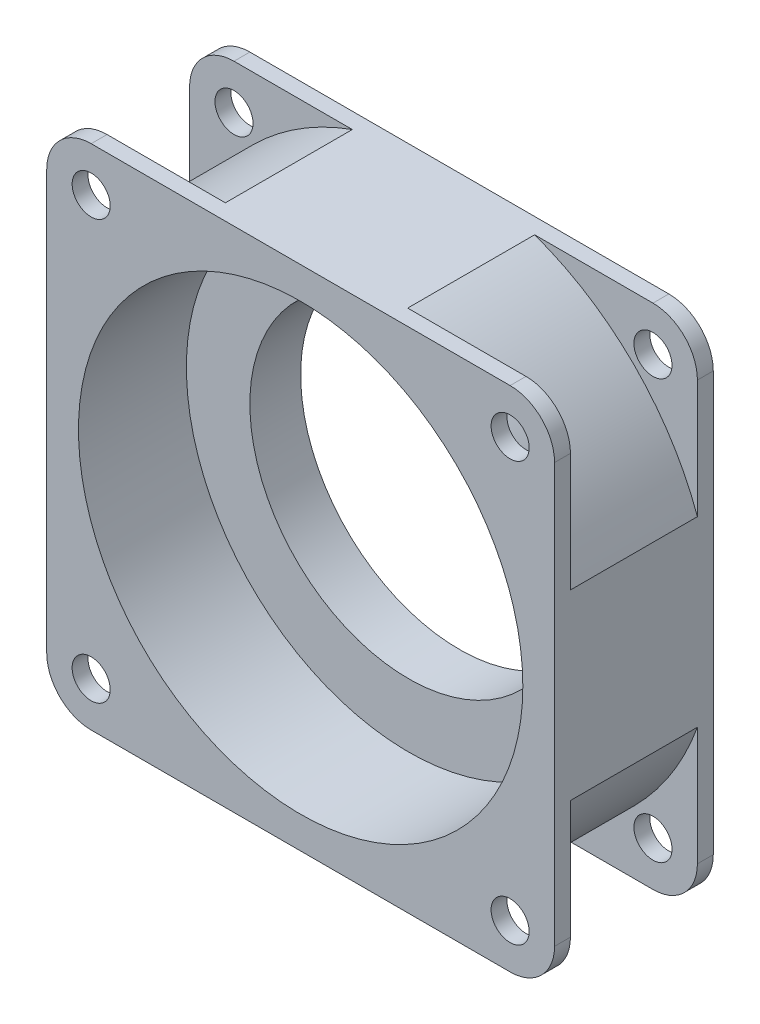
ISO-10303-21;
HEADER;
FILE_DESCRIPTION(('STEP AP214'),'2;1');
FILE_NAME('part.step','',(''),(''),'','','');
FILE_SCHEMA(('AUTOMOTIVE_DESIGN { 1 0 10303 214 1 1 1 1 }'));
ENDSEC;
DATA;
#1=APPLICATION_CONTEXT('core data for automotive mechanical design processes');
#2=APPLICATION_PROTOCOL_DEFINITION('international standard','automotive_design',2000,#1);
#3=PRODUCT_CONTEXT('',#1,'mechanical');
#4=PRODUCT('Part','Part','',(#3));
#5=PRODUCT_RELATED_PRODUCT_CATEGORY('part','',(#4));
#6=PRODUCT_DEFINITION_FORMATION('','',#4);
#7=PRODUCT_DEFINITION_CONTEXT('part definition',#1,'design');
#8=PRODUCT_DEFINITION('design','',#6,#7);
#9=PRODUCT_DEFINITION_SHAPE('','',#8);
#10=(LENGTH_UNIT() NAMED_UNIT(*) SI_UNIT(.MILLI.,.METRE.));
#11=(NAMED_UNIT(*) PLANE_ANGLE_UNIT() SI_UNIT($,.RADIAN.));
#12=(NAMED_UNIT(*) SI_UNIT($,.STERADIAN.) SOLID_ANGLE_UNIT());
#13=UNCERTAINTY_MEASURE_WITH_UNIT(LENGTH_MEASURE(1.E-05),#10,'distance_accuracy_value','');
#14=(GEOMETRIC_REPRESENTATION_CONTEXT(3) GLOBAL_UNCERTAINTY_ASSIGNED_CONTEXT((#13)) GLOBAL_UNIT_ASSIGNED_CONTEXT((#10,
#11,#12)) REPRESENTATION_CONTEXT('',''));
#15=CARTESIAN_POINT('',(0.,0.,0.));
#16=DIRECTION('',(0.,0.,1.));
#17=DIRECTION('',(1.,0.,0.));
#18=AXIS2_PLACEMENT_3D('',#15,#16,#17);
#19=CARTESIAN_POINT('',(0.,0.,12.5));
#20=DIRECTION('',(0.,0.,-1.));
#21=DIRECTION('',(-1.,0.,0.));
#22=AXIS2_PLACEMENT_3D('',#19,#20,#21);
#23=CYLINDRICAL_SURFACE('',#22,42.5);
#24=DIRECTION('',(0.,0.,-1.));
#25=VECTOR('',#24,1.);
#26=CARTESIAN_POINT('',(14.3614066163451,-40.,12.5));
#27=LINE('',#26,#25);
#28=CARTESIAN_POINT('',(14.3614066163451,-40.,10.));
#29=VERTEX_POINT('',#28);
#30=CARTESIAN_POINT('',(14.3614066163451,-40.,-10.));
#31=VERTEX_POINT('',#30);
#32=EDGE_CURVE('E403',#29,#31,#27,.T.);
#33=ORIENTED_EDGE('',*,*,#32,.T.);
#34=CARTESIAN_POINT('',(0.,0.,-10.));
#35=DIRECTION('',(0.,0.,1.));
#36=DIRECTION('',(1.,0.,0.));
#37=AXIS2_PLACEMENT_3D('',#34,#35,#36);
#38=CIRCLE('',#37,42.5);
#39=CARTESIAN_POINT('',(40.,-14.3614066163451,-10.));
#40=VERTEX_POINT('',#39);
#41=EDGE_CURVE('E282',#31,#40,#38,.T.);
#42=ORIENTED_EDGE('',*,*,#41,.T.);
#43=DIRECTION('',(0.,0.,-1.));
#44=VECTOR('',#43,1.);
#45=CARTESIAN_POINT('',(40.,-14.3614066163451,12.5));
#46=LINE('',#45,#44);
#47=CARTESIAN_POINT('',(40.,-14.3614066163451,10.));
#48=VERTEX_POINT('',#47);
#49=EDGE_CURVE('E53',#48,#40,#46,.T.);
#50=ORIENTED_EDGE('',*,*,#49,.F.);
#51=CARTESIAN_POINT('',(0.,0.,10.));
#52=DIRECTION('',(0.,0.,1.));
#53=DIRECTION('',(1.,0.,0.));
#54=AXIS2_PLACEMENT_3D('',#51,#52,#53);
#55=CIRCLE('',#54,42.5);
#56=EDGE_CURVE('E311',#29,#48,#55,.T.);
#57=ORIENTED_EDGE('',*,*,#56,.F.);
#58=EDGE_LOOP('',(#33,#42,#50,#57));
#59=FACE_BOUND('',#58,.T.);
#60=ADVANCED_FACE('F39',(#59),#23,.T.);
#61=CARTESIAN_POINT('',(0.,0.,12.5));
#62=DIRECTION('',(0.,0.,-1.));
#63=DIRECTION('',(-1.,0.,0.));
#64=AXIS2_PLACEMENT_3D('',#61,#62,#63);
#65=CYLINDRICAL_SURFACE('',#64,42.5);
#66=DIRECTION('',(0.,0.,-1.));
#67=VECTOR('',#66,1.);
#68=CARTESIAN_POINT('',(-40.,-14.3614066163451,12.5));
#69=LINE('',#68,#67);
#70=CARTESIAN_POINT('',(-40.,-14.3614066163451,10.));
#71=VERTEX_POINT('',#70);
#72=CARTESIAN_POINT('',(-40.,-14.3614066163451,-10.));
#73=VERTEX_POINT('',#72);
#74=EDGE_CURVE('E391',#71,#73,#69,.T.);
#75=ORIENTED_EDGE('',*,*,#74,.T.);
#76=CARTESIAN_POINT('',(0.,0.,-10.));
#77=DIRECTION('',(0.,0.,1.));
#78=DIRECTION('',(1.,0.,0.));
#79=AXIS2_PLACEMENT_3D('',#76,#77,#78);
#80=CIRCLE('',#79,42.5);
#81=CARTESIAN_POINT('',(-14.3614066163451,-40.,-10.));
#82=VERTEX_POINT('',#81);
#83=EDGE_CURVE('E255',#73,#82,#80,.T.);
#84=ORIENTED_EDGE('',*,*,#83,.T.);
#85=DIRECTION('',(0.,0.,-1.));
#86=VECTOR('',#85,1.);
#87=CARTESIAN_POINT('',(-14.3614066163451,-40.,12.5));
#88=LINE('',#87,#86);
#89=CARTESIAN_POINT('',(-14.3614066163451,-40.,10.));
#90=VERTEX_POINT('',#89);
#91=EDGE_CURVE('E65',#90,#82,#88,.T.);
#92=ORIENTED_EDGE('',*,*,#91,.F.);
#93=CARTESIAN_POINT('',(0.,0.,10.));
#94=DIRECTION('',(0.,0.,1.));
#95=DIRECTION('',(1.,0.,0.));
#96=AXIS2_PLACEMENT_3D('',#93,#94,#95);
#97=CIRCLE('',#96,42.5);
#98=EDGE_CURVE('E347',#71,#90,#97,.T.);
#99=ORIENTED_EDGE('',*,*,#98,.F.);
#100=EDGE_LOOP('',(#75,#84,#92,#99));
#101=FACE_BOUND('',#100,.T.);
#102=ADVANCED_FACE('F498',(#101),#65,.T.);
#103=CARTESIAN_POINT('',(0.,0.,12.5));
#104=DIRECTION('',(0.,0.,-1.));
#105=DIRECTION('',(-1.,0.,0.));
#106=AXIS2_PLACEMENT_3D('',#103,#104,#105);
#107=CYLINDRICAL_SURFACE('',#106,42.5);
#108=DIRECTION('',(0.,0.,-1.));
#109=VECTOR('',#108,1.);
#110=CARTESIAN_POINT('',(-14.3614066163451,40.,12.5));
#111=LINE('',#110,#109);
#112=CARTESIAN_POINT('',(-14.3614066163451,40.,10.));
#113=VERTEX_POINT('',#112);
#114=CARTESIAN_POINT('',(-14.3614066163451,40.,-10.));
#115=VERTEX_POINT('',#114);
#116=EDGE_CURVE('E396',#113,#115,#111,.T.);
#117=ORIENTED_EDGE('',*,*,#116,.T.);
#118=CARTESIAN_POINT('',(0.,0.,-10.));
#119=DIRECTION('',(0.,0.,1.));
#120=DIRECTION('',(1.,0.,0.));
#121=AXIS2_PLACEMENT_3D('',#118,#119,#120);
#122=CIRCLE('',#121,42.5);
#123=CARTESIAN_POINT('',(-40.,14.3614066163451,-10.));
#124=VERTEX_POINT('',#123);
#125=EDGE_CURVE('E913',#115,#124,#122,.T.);
#126=ORIENTED_EDGE('',*,*,#125,.T.);
#127=DIRECTION('',(0.,0.,-1.));
#128=VECTOR('',#127,1.);
#129=CARTESIAN_POINT('',(-40.,14.3614066163451,12.5));
#130=LINE('',#129,#128);
#131=CARTESIAN_POINT('',(-40.,14.3614066163451,10.));
#132=VERTEX_POINT('',#131);
#133=EDGE_CURVE('E398',#132,#124,#130,.T.);
#134=ORIENTED_EDGE('',*,*,#133,.F.);
#135=CARTESIAN_POINT('',(0.,0.,10.));
#136=DIRECTION('',(0.,0.,1.));
#137=DIRECTION('',(1.,0.,0.));
#138=AXIS2_PLACEMENT_3D('',#135,#136,#137);
#139=CIRCLE('',#138,42.5);
#140=EDGE_CURVE('E372',#113,#132,#139,.T.);
#141=ORIENTED_EDGE('',*,*,#140,.F.);
#142=EDGE_LOOP('',(#117,#126,#134,#141));
#143=FACE_BOUND('',#142,.T.);
#144=ADVANCED_FACE('F529',(#143),#107,.T.);
#145=CARTESIAN_POINT('',(33.,33.,12.5));
#146=DIRECTION('',(0.,0.,-1.));
#147=DIRECTION('',(-1.,0.,0.));
#148=AXIS2_PLACEMENT_3D('',#145,#146,#147);
#149=CYLINDRICAL_SURFACE('',#148,7.);
#150=CARTESIAN_POINT('',(33.,33.,10.));
#151=DIRECTION('',(0.,0.,1.));
#152=DIRECTION('',(1.,0.,0.));
#153=AXIS2_PLACEMENT_3D('',#150,#151,#152);
#154=CIRCLE('',#153,7.);
#155=CARTESIAN_POINT('',(33.,40.,10.));
#156=VERTEX_POINT('',#155);
#157=CARTESIAN_POINT('',(40.,32.9999999999999,10.));
#158=VERTEX_POINT('',#157);
#159=EDGE_CURVE('E410',#156,#158,#154,.F.);
#160=ORIENTED_EDGE('',*,*,#159,.F.);
#161=DIRECTION('',(0.,0.,-1.));
#162=VECTOR('',#161,1.);
#163=CARTESIAN_POINT('',(33.,40.,12.5));
#164=LINE('',#163,#162);
#165=CARTESIAN_POINT('',(33.,40.,12.5));
#166=VERTEX_POINT('',#165);
#167=EDGE_CURVE('E50',#166,#156,#164,.T.);
#168=ORIENTED_EDGE('',*,*,#167,.F.);
#169=CARTESIAN_POINT('',(33.,33.,12.5));
#170=DIRECTION('',(0.,0.,1.));
#171=DIRECTION('',(1.,0.,0.));
#172=AXIS2_PLACEMENT_3D('',#169,#170,#171);
#173=CIRCLE('',#172,7.);
#174=CARTESIAN_POINT('',(40.,32.9999999999999,12.5));
#175=VERTEX_POINT('',#174);
#176=EDGE_CURVE('E409',#166,#175,#173,.F.);
#177=ORIENTED_EDGE('',*,*,#176,.T.);
#178=DIRECTION('',(0.,0.,-1.));
#179=VECTOR('',#178,1.);
#180=CARTESIAN_POINT('',(40.,32.9999999999999,12.5));
#181=LINE('',#180,#179);
#182=EDGE_CURVE('E419',#175,#158,#181,.T.);
#183=ORIENTED_EDGE('',*,*,#182,.T.);
#184=EDGE_LOOP('',(#160,#168,#177,#183));
#185=FACE_BOUND('',#184,.T.);
#186=ADVANCED_FACE('F41',(#185),#149,.T.);
#187=CARTESIAN_POINT('',(0.,40.,12.5));
#188=DIRECTION('',(0.,1.,0.));
#189=DIRECTION('',(0.,0.,1.));
#190=AXIS2_PLACEMENT_3D('',#187,#188,#189);
#191=PLANE('',#190);
#192=DIRECTION('',(1.,0.,0.));
#193=VECTOR('',#192,1.);
#194=CARTESIAN_POINT('',(0.,40.,-10.));
#195=LINE('',#194,#193);
#196=CARTESIAN_POINT('',(-33.,40.,-10.));
#197=VERTEX_POINT('',#196);
#198=EDGE_CURVE('E908',#197,#115,#195,.T.);
#199=ORIENTED_EDGE('',*,*,#198,.T.);
#200=ORIENTED_EDGE('',*,*,#116,.F.);
#201=DIRECTION('',(1.,0.,0.));
#202=VECTOR('',#201,1.);
#203=CARTESIAN_POINT('',(0.,40.,10.));
#204=LINE('',#203,#202);
#205=CARTESIAN_POINT('',(-33.,40.,10.));
#206=VERTEX_POINT('',#205);
#207=EDGE_CURVE('E362',#206,#113,#204,.T.);
#208=ORIENTED_EDGE('',*,*,#207,.F.);
#209=DIRECTION('',(0.,0.,-1.));
#210=VECTOR('',#209,1.);
#211=CARTESIAN_POINT('',(-33.,40.,12.5));
#212=LINE('',#211,#210);
#213=CARTESIAN_POINT('',(-33.,40.,12.5));
#214=VERTEX_POINT('',#213);
#215=EDGE_CURVE('E364',#214,#206,#212,.T.);
#216=ORIENTED_EDGE('',*,*,#215,.F.);
#217=DIRECTION('',(1.,0.,0.));
#218=VECTOR('',#217,1.);
#219=CARTESIAN_POINT('',(0.,40.,12.5));
#220=LINE('',#219,#218);
#221=EDGE_CURVE('E413',#214,#166,#220,.T.);
#222=ORIENTED_EDGE('',*,*,#221,.T.);
#223=ORIENTED_EDGE('',*,*,#167,.T.);
#224=DIRECTION('',(1.,0.,0.));
#225=VECTOR('',#224,1.);
#226=CARTESIAN_POINT('',(0.,40.,10.));
#227=LINE('',#226,#225);
#228=CARTESIAN_POINT('',(14.3614066163451,40.,10.));
#229=VERTEX_POINT('',#228);
#230=EDGE_CURVE('E421',#229,#156,#227,.T.);
#231=ORIENTED_EDGE('',*,*,#230,.F.);
#232=DIRECTION('',(0.,0.,-1.));
#233=VECTOR('',#232,1.);
#234=CARTESIAN_POINT('',(14.3614066163451,40.,12.5));
#235=LINE('',#234,#233);
#236=CARTESIAN_POINT('',(14.3614066163451,40.,-10.));
#237=VERTEX_POINT('',#236);
#238=EDGE_CURVE('E399',#229,#237,#235,.T.);
#239=ORIENTED_EDGE('',*,*,#238,.T.);
#240=DIRECTION('',(1.,0.,0.));
#241=VECTOR('',#240,1.);
#242=CARTESIAN_POINT('',(0.,40.,-10.));
#243=LINE('',#242,#241);
#244=CARTESIAN_POINT('',(33.,40.,-10.));
#245=VERTEX_POINT('',#244);
#246=EDGE_CURVE('E303',#237,#245,#243,.T.);
#247=ORIENTED_EDGE('',*,*,#246,.T.);
#248=DIRECTION('',(0.,0.,1.));
#249=VECTOR('',#248,1.);
#250=CARTESIAN_POINT('',(33.,40.,-12.5));
#251=LINE('',#250,#249);
#252=CARTESIAN_POINT('',(33.,40.,-12.5));
#253=VERTEX_POINT('',#252);
#254=EDGE_CURVE('E209',#253,#245,#251,.T.);
#255=ORIENTED_EDGE('',*,*,#254,.F.);
#256=DIRECTION('',(1.,0.,0.));
#257=VECTOR('',#256,1.);
#258=CARTESIAN_POINT('',(0.,40.,-12.5));
#259=LINE('',#258,#257);
#260=CARTESIAN_POINT('',(-33.,40.,-12.5));
#261=VERTEX_POINT('',#260);
#262=EDGE_CURVE('E205',#261,#253,#259,.T.);
#263=ORIENTED_EDGE('',*,*,#262,.F.);
#264=DIRECTION('',(0.,0.,1.));
#265=VECTOR('',#264,1.);
#266=CARTESIAN_POINT('',(-33.,40.,-12.5));
#267=LINE('',#266,#265);
#268=EDGE_CURVE('E210',#261,#197,#267,.T.);
#269=ORIENTED_EDGE('',*,*,#268,.T.);
#270=EDGE_LOOP('',(#199,#200,#208,#216,#222,#223,#231,#239,#247,#255,#263,#269));
#271=FACE_BOUND('',#270,.T.);
#272=ADVANCED_FACE('F202',(#271),#191,.T.);
#273=CARTESIAN_POINT('',(40.,0.,12.5));
#274=DIRECTION('',(-1.,0.,0.));
#275=DIRECTION('',(0.,0.,1.));
#276=AXIS2_PLACEMENT_3D('',#273,#274,#275);
#277=PLANE('',#276);
#278=DIRECTION('',(0.,1.,0.));
#279=VECTOR('',#278,1.);
#280=CARTESIAN_POINT('',(40.,0.,-12.5));
#281=LINE('',#280,#279);
#282=CARTESIAN_POINT('',(40.,-33.,-12.5));
#283=VERTEX_POINT('',#282);
#284=CARTESIAN_POINT('',(40.,32.9999999999999,-12.5));
#285=VERTEX_POINT('',#284);
#286=EDGE_CURVE('E214',#283,#285,#281,.T.);
#287=ORIENTED_EDGE('',*,*,#286,.T.);
#288=DIRECTION('',(0.,0.,1.));
#289=VECTOR('',#288,1.);
#290=CARTESIAN_POINT('',(40.,32.9999999999999,-12.5));
#291=LINE('',#290,#289);
#292=CARTESIAN_POINT('',(40.,32.9999999999999,-10.));
#293=VERTEX_POINT('',#292);
#294=EDGE_CURVE('E308',#285,#293,#291,.T.);
#295=ORIENTED_EDGE('',*,*,#294,.T.);
#296=DIRECTION('',(0.,1.,0.));
#297=VECTOR('',#296,1.);
#298=CARTESIAN_POINT('',(40.,0.,-10.));
#299=LINE('',#298,#297);
#300=CARTESIAN_POINT('',(40.,14.3614066163451,-10.));
#301=VERTEX_POINT('',#300);
#302=EDGE_CURVE('E234',#301,#293,#299,.T.);
#303=ORIENTED_EDGE('',*,*,#302,.F.);
#304=DIRECTION('',(0.,0.,-1.));
#305=VECTOR('',#304,1.);
#306=CARTESIAN_POINT('',(40.,14.3614066163451,12.5));
#307=LINE('',#306,#305);
#308=CARTESIAN_POINT('',(40.,14.3614066163451,10.));
#309=VERTEX_POINT('',#308);
#310=EDGE_CURVE('E405',#309,#301,#307,.T.);
#311=ORIENTED_EDGE('',*,*,#310,.F.);
#312=DIRECTION('',(0.,1.,0.));
#313=VECTOR('',#312,1.);
#314=CARTESIAN_POINT('',(40.,0.,10.));
#315=LINE('',#314,#313);
#316=EDGE_CURVE('E427',#309,#158,#315,.T.);
#317=ORIENTED_EDGE('',*,*,#316,.T.);
#318=ORIENTED_EDGE('',*,*,#182,.F.);
#319=DIRECTION('',(0.,1.,0.));
#320=VECTOR('',#319,1.);
#321=CARTESIAN_POINT('',(40.,0.,12.5));
#322=LINE('',#321,#320);
#323=CARTESIAN_POINT('',(40.,-33.,12.5));
#324=VERTEX_POINT('',#323);
#325=EDGE_CURVE('E414',#324,#175,#322,.T.);
#326=ORIENTED_EDGE('',*,*,#325,.F.);
#327=DIRECTION('',(0.,0.,-1.));
#328=VECTOR('',#327,1.);
#329=CARTESIAN_POINT('',(40.,-33.,12.5));
#330=LINE('',#329,#328);
#331=CARTESIAN_POINT('',(40.,-33.,10.));
#332=VERTEX_POINT('',#331);
#333=EDGE_CURVE('E316',#324,#332,#330,.T.);
#334=ORIENTED_EDGE('',*,*,#333,.T.);
#335=DIRECTION('',(0.,1.,0.));
#336=VECTOR('',#335,1.);
#337=CARTESIAN_POINT('',(40.,0.,10.));
#338=LINE('',#337,#336);
#339=EDGE_CURVE('E322',#332,#48,#338,.T.);
#340=ORIENTED_EDGE('',*,*,#339,.T.);
#341=ORIENTED_EDGE('',*,*,#49,.T.);
#342=DIRECTION('',(0.,1.,0.));
#343=VECTOR('',#342,1.);
#344=CARTESIAN_POINT('',(40.,0.,-10.));
#345=LINE('',#344,#343);
#346=CARTESIAN_POINT('',(40.,-33.,-10.));
#347=VERTEX_POINT('',#346);
#348=EDGE_CURVE('E281',#347,#40,#345,.T.);
#349=ORIENTED_EDGE('',*,*,#348,.F.);
#350=DIRECTION('',(0.,0.,1.));
#351=VECTOR('',#350,1.);
#352=CARTESIAN_POINT('',(40.,-33.,-12.5));
#353=LINE('',#352,#351);
#354=EDGE_CURVE('E253',#283,#347,#353,.T.);
#355=ORIENTED_EDGE('',*,*,#354,.F.);
#356=EDGE_LOOP('',(#287,#295,#303,#311,#317,#318,#326,#334,#340,#341,#349,#355));
#357=FACE_BOUND('',#356,.T.);
#358=ADVANCED_FACE('F446',(#357),#277,.F.);
#359=CARTESIAN_POINT('',(33.,33.,12.5));
#360=DIRECTION('',(0.,0.,-1.));
#361=DIRECTION('',(-1.,0.,0.));
#362=AXIS2_PLACEMENT_3D('',#359,#360,#361);
#363=CYLINDRICAL_SURFACE('',#362,3.);
#364=CARTESIAN_POINT('',(33.,33.,12.5));
#365=DIRECTION('',(0.,0.,1.));
#366=DIRECTION('',(1.,0.,0.));
#367=AXIS2_PLACEMENT_3D('',#364,#365,#366);
#368=CIRCLE('',#367,3.);
#369=CARTESIAN_POINT('',(36.,33.,12.5));
#370=VERTEX_POINT('',#369);
#371=EDGE_CURVE('E417',#370,#370,#368,.F.);
#372=ORIENTED_EDGE('',*,*,#371,.F.);
#373=EDGE_LOOP('',(#372));
#374=FACE_BOUND('',#373,.T.);
#375=CARTESIAN_POINT('',(33.,33.,10.));
#376=DIRECTION('',(0.,0.,1.));
#377=DIRECTION('',(1.,0.,0.));
#378=AXIS2_PLACEMENT_3D('',#375,#376,#377);
#379=CIRCLE('',#378,3.);
#380=CARTESIAN_POINT('',(36.,33.,10.));
#381=VERTEX_POINT('',#380);
#382=EDGE_CURVE('E415',#381,#381,#379,.F.);
#383=ORIENTED_EDGE('',*,*,#382,.T.);
#384=EDGE_LOOP('',(#383));
#385=FACE_BOUND('',#384,.T.);
#386=ADVANCED_FACE('F543',(#374,#385),#363,.F.);
#387=CARTESIAN_POINT('',(0.,0.,12.5));
#388=DIRECTION('',(0.,0.,1.));
#389=DIRECTION('',(1.,0.,0.));
#390=AXIS2_PLACEMENT_3D('',#387,#388,#389);
#391=PLANE('',#390);
#392=ORIENTED_EDGE('',*,*,#176,.F.);
#393=ORIENTED_EDGE('',*,*,#221,.F.);
#394=CARTESIAN_POINT('',(-33.,33.,12.5));
#395=DIRECTION('',(0.,0.,1.));
#396=DIRECTION('',(1.,0.,0.));
#397=AXIS2_PLACEMENT_3D('',#394,#395,#396);
#398=CIRCLE('',#397,7.);
#399=CARTESIAN_POINT('',(-40.,32.9999999999999,12.5));
#400=VERTEX_POINT('',#399);
#401=EDGE_CURVE('E363',#400,#214,#398,.F.);
#402=ORIENTED_EDGE('',*,*,#401,.F.);
#403=DIRECTION('',(0.,1.,0.));
#404=VECTOR('',#403,1.);
#405=CARTESIAN_POINT('',(-40.,0.,12.5));
#406=LINE('',#405,#404);
#407=CARTESIAN_POINT('',(-40.,-33.,12.5));
#408=VERTEX_POINT('',#407);
#409=EDGE_CURVE('E389',#408,#400,#406,.T.);
#410=ORIENTED_EDGE('',*,*,#409,.F.);
#411=CARTESIAN_POINT('',(-33.,-33.,12.5));
#412=DIRECTION('',(0.,0.,1.));
#413=DIRECTION('',(1.,0.,0.));
#414=AXIS2_PLACEMENT_3D('',#411,#412,#413);
#415=CIRCLE('',#414,7.);
#416=CARTESIAN_POINT('',(-33.,-40.,12.5));
#417=VERTEX_POINT('',#416);
#418=EDGE_CURVE('E331',#417,#408,#415,.F.);
#419=ORIENTED_EDGE('',*,*,#418,.F.);
#420=DIRECTION('',(1.,0.,0.));
#421=VECTOR('',#420,1.);
#422=CARTESIAN_POINT('',(0.,-40.,12.5));
#423=LINE('',#422,#421);
#424=CARTESIAN_POINT('',(33.,-40.,12.5));
#425=VERTEX_POINT('',#424);
#426=EDGE_CURVE('E387',#417,#425,#423,.T.);
#427=ORIENTED_EDGE('',*,*,#426,.T.);
#428=CARTESIAN_POINT('',(33.,-33.,12.5));
#429=DIRECTION('',(0.,0.,1.));
#430=DIRECTION('',(1.,0.,0.));
#431=AXIS2_PLACEMENT_3D('',#428,#429,#430);
#432=CIRCLE('',#431,7.);
#433=EDGE_CURVE('E315',#425,#324,#432,.T.);
#434=ORIENTED_EDGE('',*,*,#433,.T.);
#435=ORIENTED_EDGE('',*,*,#325,.T.);
#436=EDGE_LOOP('',(#392,#393,#402,#410,#419,#427,#434,#435));
#437=FACE_BOUND('',#436,.T.);
#438=ORIENTED_EDGE('',*,*,#371,.T.);
#439=EDGE_LOOP('',(#438));
#440=FACE_BOUND('',#439,.T.);
#441=CARTESIAN_POINT('',(0.,0.,12.5));
#442=DIRECTION('',(0.,0.,1.));
#443=DIRECTION('',(1.,0.,0.));
#444=AXIS2_PLACEMENT_3D('',#441,#442,#443);
#445=CIRCLE('',#444,35.);
#446=CARTESIAN_POINT('',(35.,0.,12.5));
#447=VERTEX_POINT('',#446);
#448=EDGE_CURVE('E382',#447,#447,#445,.T.);
#449=ORIENTED_EDGE('',*,*,#448,.F.);
#450=EDGE_LOOP('',(#449));
#451=FACE_BOUND('',#450,.T.);
#452=CARTESIAN_POINT('',(-33.,33.,12.5));
#453=DIRECTION('',(0.,0.,1.));
#454=DIRECTION('',(1.,0.,0.));
#455=AXIS2_PLACEMENT_3D('',#452,#453,#454);
#456=CIRCLE('',#455,3.);
#457=CARTESIAN_POINT('',(-30.,33.,12.5));
#458=VERTEX_POINT('',#457);
#459=EDGE_CURVE('E356',#458,#458,#456,.T.);
#460=ORIENTED_EDGE('',*,*,#459,.F.);
#461=EDGE_LOOP('',(#460));
#462=FACE_BOUND('',#461,.T.);
#463=CARTESIAN_POINT('',(-33.,-33.,12.5));
#464=DIRECTION('',(0.,0.,1.));
#465=DIRECTION('',(1.,0.,0.));
#466=AXIS2_PLACEMENT_3D('',#463,#464,#465);
#467=CIRCLE('',#466,3.00000000000002);
#468=CARTESIAN_POINT('',(-30.,-33.,12.5));
#469=VERTEX_POINT('',#468);
#470=EDGE_CURVE('E340',#469,#469,#467,.F.);
#471=ORIENTED_EDGE('',*,*,#470,.T.);
#472=EDGE_LOOP('',(#471));
#473=FACE_BOUND('',#472,.T.);
#474=CARTESIAN_POINT('',(33.,-33.,12.5));
#475=DIRECTION('',(0.,0.,1.));
#476=DIRECTION('',(1.,0.,0.));
#477=AXIS2_PLACEMENT_3D('',#474,#475,#476);
#478=CIRCLE('',#477,3.00000000000001);
#479=CARTESIAN_POINT('',(36.,-33.,12.5));
#480=VERTEX_POINT('',#479);
#481=EDGE_CURVE('E310',#480,#480,#478,.T.);
#482=ORIENTED_EDGE('',*,*,#481,.F.);
#483=EDGE_LOOP('',(#482));
#484=FACE_BOUND('',#483,.T.);
#485=ADVANCED_FACE('F490',(#437,#440,#451,#462,#473,#484),#391,.T.);
#486=CARTESIAN_POINT('',(0.,0.,10.));
#487=DIRECTION('',(0.,0.,1.));
#488=DIRECTION('',(1.,0.,0.));
#489=AXIS2_PLACEMENT_3D('',#486,#487,#488);
#490=PLANE('',#489);
#491=ORIENTED_EDGE('',*,*,#159,.T.);
#492=ORIENTED_EDGE('',*,*,#316,.F.);
#493=CARTESIAN_POINT('',(0.,0.,10.));
#494=DIRECTION('',(0.,0.,1.));
#495=DIRECTION('',(1.,0.,0.));
#496=AXIS2_PLACEMENT_3D('',#493,#494,#495);
#497=CIRCLE('',#496,42.5);
#498=EDGE_CURVE('E426',#309,#229,#497,.T.);
#499=ORIENTED_EDGE('',*,*,#498,.T.);
#500=ORIENTED_EDGE('',*,*,#230,.T.);
#501=EDGE_LOOP('',(#491,#492,#499,#500));
#502=FACE_BOUND('',#501,.T.);
#503=ORIENTED_EDGE('',*,*,#382,.F.);
#504=EDGE_LOOP('',(#503));
#505=FACE_BOUND('',#504,.T.);
#506=ADVANCED_FACE('F445',(#502,#505),#490,.F.);
#507=CARTESIAN_POINT('',(0.,-40.,12.5));
#508=DIRECTION('',(0.,1.,0.));
#509=DIRECTION('',(0.,0.,1.));
#510=AXIS2_PLACEMENT_3D('',#507,#508,#509);
#511=PLANE('',#510);
#512=DIRECTION('',(1.,0.,0.));
#513=VECTOR('',#512,1.);
#514=CARTESIAN_POINT('',(0.,-40.,-12.5));
#515=LINE('',#514,#513);
#516=CARTESIAN_POINT('',(-33.,-40.,-12.5));
#517=VERTEX_POINT('',#516);
#518=CARTESIAN_POINT('',(33.,-40.,-12.5));
#519=VERTEX_POINT('',#518);
#520=EDGE_CURVE('E385',#517,#519,#515,.T.);
#521=ORIENTED_EDGE('',*,*,#520,.T.);
#522=DIRECTION('',(0.,0.,1.));
#523=VECTOR('',#522,1.);
#524=CARTESIAN_POINT('',(33.,-40.,-12.5));
#525=LINE('',#524,#523);
#526=CARTESIAN_POINT('',(33.,-40.,-10.));
#527=VERTEX_POINT('',#526);
#528=EDGE_CURVE('E272',#519,#527,#525,.T.);
#529=ORIENTED_EDGE('',*,*,#528,.T.);
#530=DIRECTION('',(1.,0.,0.));
#531=VECTOR('',#530,1.);
#532=CARTESIAN_POINT('',(0.,-40.,-10.));
#533=LINE('',#532,#531);
#534=EDGE_CURVE('E280',#31,#527,#533,.T.);
#535=ORIENTED_EDGE('',*,*,#534,.F.);
#536=ORIENTED_EDGE('',*,*,#32,.F.);
#537=DIRECTION('',(1.,0.,0.));
#538=VECTOR('',#537,1.);
#539=CARTESIAN_POINT('',(0.,-40.,10.));
#540=LINE('',#539,#538);
#541=CARTESIAN_POINT('',(33.,-40.,10.));
#542=VERTEX_POINT('',#541);
#543=EDGE_CURVE('E317',#29,#542,#540,.T.);
#544=ORIENTED_EDGE('',*,*,#543,.T.);
#545=DIRECTION('',(0.,0.,-1.));
#546=VECTOR('',#545,1.);
#547=CARTESIAN_POINT('',(33.,-40.,12.5));
#548=LINE('',#547,#546);
#549=EDGE_CURVE('E329',#425,#542,#548,.T.);
#550=ORIENTED_EDGE('',*,*,#549,.F.);
#551=ORIENTED_EDGE('',*,*,#426,.F.);
#552=DIRECTION('',(0.,0.,-1.));
#553=VECTOR('',#552,1.);
#554=CARTESIAN_POINT('',(-33.,-40.,12.5));
#555=LINE('',#554,#553);
#556=CARTESIAN_POINT('',(-33.,-40.,10.));
#557=VERTEX_POINT('',#556);
#558=EDGE_CURVE('E353',#417,#557,#555,.T.);
#559=ORIENTED_EDGE('',*,*,#558,.T.);
#560=DIRECTION('',(1.,0.,0.));
#561=VECTOR('',#560,1.);
#562=CARTESIAN_POINT('',(0.,-40.,10.));
#563=LINE('',#562,#561);
#564=EDGE_CURVE('E342',#557,#90,#563,.T.);
#565=ORIENTED_EDGE('',*,*,#564,.T.);
#566=ORIENTED_EDGE('',*,*,#91,.T.);
#567=DIRECTION('',(1.,0.,0.));
#568=VECTOR('',#567,1.);
#569=CARTESIAN_POINT('',(0.,-40.,-10.));
#570=LINE('',#569,#568);
#571=CARTESIAN_POINT('',(-33.,-40.,-10.));
#572=VERTEX_POINT('',#571);
#573=EDGE_CURVE('E260',#572,#82,#570,.T.);
#574=ORIENTED_EDGE('',*,*,#573,.F.);
#575=DIRECTION('',(0.,0.,1.));
#576=VECTOR('',#575,1.);
#577=CARTESIAN_POINT('',(-33.,-40.,-12.5));
#578=LINE('',#577,#576);
#579=EDGE_CURVE('E248',#517,#572,#578,.T.);
#580=ORIENTED_EDGE('',*,*,#579,.F.);
#581=EDGE_LOOP('',(#521,#529,#535,#536,#544,#550,#551,#559,#565,#566,#574,#580));
#582=FACE_BOUND('',#581,.T.);
#583=ADVANCED_FACE('F461',(#582),#511,.F.);
#584=CARTESIAN_POINT('',(0.,0.,12.5));
#585=DIRECTION('',(0.,0.,-1.));
#586=DIRECTION('',(-1.,0.,0.));
#587=AXIS2_PLACEMENT_3D('',#584,#585,#586);
#588=CYLINDRICAL_SURFACE('',#587,42.5);
#589=ORIENTED_EDGE('',*,*,#310,.T.);
#590=CARTESIAN_POINT('',(0.,0.,-10.));
#591=DIRECTION('',(0.,0.,1.));
#592=DIRECTION('',(1.,0.,0.));
#593=AXIS2_PLACEMENT_3D('',#590,#591,#592);
#594=CIRCLE('',#593,42.5);
#595=EDGE_CURVE('E299',#301,#237,#594,.T.);
#596=ORIENTED_EDGE('',*,*,#595,.T.);
#597=ORIENTED_EDGE('',*,*,#238,.F.);
#598=ORIENTED_EDGE('',*,*,#498,.F.);
#599=EDGE_LOOP('',(#589,#596,#597,#598));
#600=FACE_BOUND('',#599,.T.);
#601=ADVANCED_FACE('F447',(#600),#588,.T.);
#602=CARTESIAN_POINT('',(-40.,0.,12.5));
#603=DIRECTION('',(-1.,0.,0.));
#604=DIRECTION('',(0.,0.,1.));
#605=AXIS2_PLACEMENT_3D('',#602,#603,#604);
#606=PLANE('',#605);
#607=DIRECTION('',(0.,1.,0.));
#608=VECTOR('',#607,1.);
#609=CARTESIAN_POINT('',(-40.,0.,-10.));
#610=LINE('',#609,#608);
#611=CARTESIAN_POINT('',(-40.,-33.,-10.));
#612=VERTEX_POINT('',#611);
#613=EDGE_CURVE('E249',#612,#73,#610,.T.);
#614=ORIENTED_EDGE('',*,*,#613,.T.);
#615=ORIENTED_EDGE('',*,*,#74,.F.);
#616=DIRECTION('',(0.,1.,0.));
#617=VECTOR('',#616,1.);
#618=CARTESIAN_POINT('',(-40.,0.,10.));
#619=LINE('',#618,#617);
#620=CARTESIAN_POINT('',(-40.,-33.,10.));
#621=VERTEX_POINT('',#620);
#622=EDGE_CURVE('E349',#621,#71,#619,.T.);
#623=ORIENTED_EDGE('',*,*,#622,.F.);
#624=DIRECTION('',(0.,0.,-1.));
#625=VECTOR('',#624,1.);
#626=CARTESIAN_POINT('',(-40.,-33.,12.5));
#627=LINE('',#626,#625);
#628=EDGE_CURVE('E343',#408,#621,#627,.T.);
#629=ORIENTED_EDGE('',*,*,#628,.F.);
#630=ORIENTED_EDGE('',*,*,#409,.T.);
#631=DIRECTION('',(0.,0.,-1.));
#632=VECTOR('',#631,1.);
#633=CARTESIAN_POINT('',(-40.,32.9999999999999,12.5));
#634=LINE('',#633,#632);
#635=CARTESIAN_POINT('',(-40.,32.9999999999999,10.));
#636=VERTEX_POINT('',#635);
#637=EDGE_CURVE('E379',#400,#636,#634,.T.);
#638=ORIENTED_EDGE('',*,*,#637,.T.);
#639=DIRECTION('',(0.,1.,0.));
#640=VECTOR('',#639,1.);
#641=CARTESIAN_POINT('',(-40.,0.,10.));
#642=LINE('',#641,#640);
#643=EDGE_CURVE('E371',#132,#636,#642,.T.);
#644=ORIENTED_EDGE('',*,*,#643,.F.);
#645=ORIENTED_EDGE('',*,*,#133,.T.);
#646=DIRECTION('',(0.,1.,0.));
#647=VECTOR('',#646,1.);
#648=CARTESIAN_POINT('',(-40.,0.,-10.));
#649=LINE('',#648,#647);
#650=CARTESIAN_POINT('',(-40.,32.9999999999999,-10.));
#651=VERTEX_POINT('',#650);
#652=EDGE_CURVE('E911',#124,#651,#649,.T.);
#653=ORIENTED_EDGE('',*,*,#652,.T.);
#654=DIRECTION('',(0.,0.,1.));
#655=VECTOR('',#654,1.);
#656=CARTESIAN_POINT('',(-40.,32.9999999999999,-12.5));
#657=LINE('',#656,#655);
#658=CARTESIAN_POINT('',(-40.,32.9999999999999,-12.5));
#659=VERTEX_POINT('',#658);
#660=EDGE_CURVE('E227',#659,#651,#657,.T.);
#661=ORIENTED_EDGE('',*,*,#660,.F.);
#662=DIRECTION('',(0.,1.,0.));
#663=VECTOR('',#662,1.);
#664=CARTESIAN_POINT('',(-40.,0.,-12.5));
#665=LINE('',#664,#663);
#666=CARTESIAN_POINT('',(-40.,-33.,-12.5));
#667=VERTEX_POINT('',#666);
#668=EDGE_CURVE('E212',#667,#659,#665,.T.);
#669=ORIENTED_EDGE('',*,*,#668,.F.);
#670=DIRECTION('',(0.,0.,1.));
#671=VECTOR('',#670,1.);
#672=CARTESIAN_POINT('',(-40.,-33.,-12.5));
#673=LINE('',#672,#671);
#674=EDGE_CURVE('E265',#667,#612,#673,.T.);
#675=ORIENTED_EDGE('',*,*,#674,.T.);
#676=EDGE_LOOP('',(#614,#615,#623,#629,#630,#638,#644,#645,#653,#661,#669,#675));
#677=FACE_BOUND('',#676,.T.);
#678=ADVANCED_FACE('F493',(#677),#606,.T.);
#679=CARTESIAN_POINT('',(0.,0.,12.5));
#680=DIRECTION('',(0.,0.,-1.));
#681=DIRECTION('',(-1.,0.,0.));
#682=AXIS2_PLACEMENT_3D('',#679,#680,#681);
#683=CYLINDRICAL_SURFACE('',#682,35.);
#684=CARTESIAN_POINT('',(0.,0.,-4.5));
#685=DIRECTION('',(0.,0.,1.));
#686=DIRECTION('',(1.,0.,0.));
#687=AXIS2_PLACEMENT_3D('',#684,#685,#686);
#688=CIRCLE('',#687,35.);
#689=CARTESIAN_POINT('',(35.,0.,-4.5));
#690=VERTEX_POINT('',#689);
#691=EDGE_CURVE('E11',#690,#690,#688,.T.);
#692=ORIENTED_EDGE('',*,*,#691,.F.);
#693=EDGE_LOOP('',(#692));
#694=FACE_BOUND('',#693,.T.);
#695=ORIENTED_EDGE('',*,*,#448,.T.);
#696=EDGE_LOOP('',(#695));
#697=FACE_BOUND('',#696,.T.);
#698=ADVANCED_FACE('F540',(#694,#697),#683,.F.);
#699=CARTESIAN_POINT('',(0.,0.,-12.5));
#700=DIRECTION('',(0.,0.,1.));
#701=DIRECTION('',(1.,0.,0.));
#702=AXIS2_PLACEMENT_3D('',#699,#700,#701);
#703=PLANE('',#702);
#704=CARTESIAN_POINT('',(33.,-33.,-12.5));
#705=DIRECTION('',(0.,0.,1.));
#706=DIRECTION('',(1.,0.,0.));
#707=AXIS2_PLACEMENT_3D('',#704,#705,#706);
#708=CIRCLE('',#707,7.);
#709=EDGE_CURVE('E267',#519,#283,#708,.T.);
#710=ORIENTED_EDGE('',*,*,#709,.F.);
#711=ORIENTED_EDGE('',*,*,#520,.F.);
#712=CARTESIAN_POINT('',(-33.,-33.,-12.5));
#713=DIRECTION('',(0.,0.,1.));
#714=DIRECTION('',(1.,0.,0.));
#715=AXIS2_PLACEMENT_3D('',#712,#713,#714);
#716=CIRCLE('',#715,7.);
#717=EDGE_CURVE('E238',#517,#667,#716,.F.);
#718=ORIENTED_EDGE('',*,*,#717,.T.);
#719=ORIENTED_EDGE('',*,*,#668,.T.);
#720=CARTESIAN_POINT('',(-33.,33.,-12.5));
#721=DIRECTION('',(0.,0.,1.));
#722=DIRECTION('',(1.,0.,0.));
#723=AXIS2_PLACEMENT_3D('',#720,#721,#722);
#724=CIRCLE('',#723,7.);
#725=EDGE_CURVE('E217',#659,#261,#724,.F.);
#726=ORIENTED_EDGE('',*,*,#725,.T.);
#727=ORIENTED_EDGE('',*,*,#262,.T.);
#728=CARTESIAN_POINT('',(33.,33.,-12.5));
#729=DIRECTION('',(0.,0.,1.));
#730=DIRECTION('',(1.,0.,0.));
#731=AXIS2_PLACEMENT_3D('',#728,#729,#730);
#732=CIRCLE('',#731,7.);
#733=EDGE_CURVE('E289',#253,#285,#732,.F.);
#734=ORIENTED_EDGE('',*,*,#733,.T.);
#735=ORIENTED_EDGE('',*,*,#286,.F.);
#736=EDGE_LOOP('',(#710,#711,#718,#719,#726,#727,#734,#735));
#737=FACE_BOUND('',#736,.T.);
#738=CARTESIAN_POINT('',(33.,-33.,-12.5));
#739=DIRECTION('',(0.,0.,1.));
#740=DIRECTION('',(1.,0.,0.));
#741=AXIS2_PLACEMENT_3D('',#738,#739,#740);
#742=CIRCLE('',#741,3.00000000000001);
#743=CARTESIAN_POINT('',(36.,-33.,-12.5));
#744=VERTEX_POINT('',#743);
#745=EDGE_CURVE('E266',#744,#744,#742,.T.);
#746=ORIENTED_EDGE('',*,*,#745,.T.);
#747=EDGE_LOOP('',(#746));
#748=FACE_BOUND('',#747,.T.);
#749=CARTESIAN_POINT('',(0.,0.,-12.5));
#750=DIRECTION('',(0.,0.,1.));
#751=DIRECTION('',(1.,0.,0.));
#752=AXIS2_PLACEMENT_3D('',#749,#750,#751);
#753=CIRCLE('',#752,25.);
#754=CARTESIAN_POINT('',(25.,0.,-12.5));
#755=VERTEX_POINT('',#754);
#756=EDGE_CURVE('E279',#755,#755,#753,.T.);
#757=ORIENTED_EDGE('',*,*,#756,.T.);
#758=EDGE_LOOP('',(#757));
#759=FACE_BOUND('',#758,.T.);
#760=CARTESIAN_POINT('',(33.,33.,-12.5));
#761=DIRECTION('',(0.,0.,1.));
#762=DIRECTION('',(1.,0.,0.));
#763=AXIS2_PLACEMENT_3D('',#760,#761,#762);
#764=CIRCLE('',#763,3.);
#765=CARTESIAN_POINT('',(36.,33.,-12.5));
#766=VERTEX_POINT('',#765);
#767=EDGE_CURVE('E295',#766,#766,#764,.F.);
#768=ORIENTED_EDGE('',*,*,#767,.F.);
#769=EDGE_LOOP('',(#768));
#770=FACE_BOUND('',#769,.T.);
#771=CARTESIAN_POINT('',(-33.,33.,-12.5));
#772=DIRECTION('',(0.,0.,1.));
#773=DIRECTION('',(1.,0.,0.));
#774=AXIS2_PLACEMENT_3D('',#771,#772,#773);
#775=CIRCLE('',#774,3.);
#776=CARTESIAN_POINT('',(-30.,33.,-12.5));
#777=VERTEX_POINT('',#776);
#778=EDGE_CURVE('E230',#777,#777,#775,.T.);
#779=ORIENTED_EDGE('',*,*,#778,.T.);
#780=EDGE_LOOP('',(#779));
#781=FACE_BOUND('',#780,.T.);
#782=CARTESIAN_POINT('',(-33.,-33.,-12.5));
#783=DIRECTION('',(0.,0.,1.));
#784=DIRECTION('',(1.,0.,0.));
#785=AXIS2_PLACEMENT_3D('',#782,#783,#784);
#786=CIRCLE('',#785,3.00000000000002);
#787=CARTESIAN_POINT('',(-30.,-33.,-12.5));
#788=VERTEX_POINT('',#787);
#789=EDGE_CURVE('E245',#788,#788,#786,.F.);
#790=ORIENTED_EDGE('',*,*,#789,.F.);
#791=EDGE_LOOP('',(#790));
#792=FACE_BOUND('',#791,.T.);
#793=ADVANCED_FACE('F219',(#737,#748,#759,#770,#781,#792),#703,.F.);
#794=CARTESIAN_POINT('',(-33.,33.,12.5));
#795=DIRECTION('',(0.,0.,-1.));
#796=DIRECTION('',(-1.,0.,0.));
#797=AXIS2_PLACEMENT_3D('',#794,#795,#796);
#798=CYLINDRICAL_SURFACE('',#797,7.);
#799=CARTESIAN_POINT('',(-33.,33.,10.));
#800=DIRECTION('',(0.,0.,1.));
#801=DIRECTION('',(1.,0.,0.));
#802=AXIS2_PLACEMENT_3D('',#799,#800,#801);
#803=CIRCLE('',#802,7.);
#804=EDGE_CURVE('E366',#636,#206,#803,.F.);
#805=ORIENTED_EDGE('',*,*,#804,.F.);
#806=ORIENTED_EDGE('',*,*,#637,.F.);
#807=ORIENTED_EDGE('',*,*,#401,.T.);
#808=ORIENTED_EDGE('',*,*,#215,.T.);
#809=EDGE_LOOP('',(#805,#806,#807,#808));
#810=FACE_BOUND('',#809,.T.);
#811=ADVANCED_FACE('F564',(#810),#798,.T.);
#812=CARTESIAN_POINT('',(-33.,33.,12.5));
#813=DIRECTION('',(0.,0.,-1.));
#814=DIRECTION('',(-1.,0.,0.));
#815=AXIS2_PLACEMENT_3D('',#812,#813,#814);
#816=CYLINDRICAL_SURFACE('',#815,3.);
#817=ORIENTED_EDGE('',*,*,#459,.T.);
#818=EDGE_LOOP('',(#817));
#819=FACE_BOUND('',#818,.T.);
#820=CARTESIAN_POINT('',(-33.,33.,10.));
#821=DIRECTION('',(0.,0.,1.));
#822=DIRECTION('',(1.,0.,0.));
#823=AXIS2_PLACEMENT_3D('',#820,#821,#822);
#824=CIRCLE('',#823,3.);
#825=CARTESIAN_POINT('',(-30.,33.,10.));
#826=VERTEX_POINT('',#825);
#827=EDGE_CURVE('E360',#826,#826,#824,.T.);
#828=ORIENTED_EDGE('',*,*,#827,.F.);
#829=EDGE_LOOP('',(#828));
#830=FACE_BOUND('',#829,.T.);
#831=ADVANCED_FACE('F567',(#819,#830),#816,.F.);
#832=CARTESIAN_POINT('',(0.,0.,10.));
#833=DIRECTION('',(0.,0.,1.));
#834=DIRECTION('',(1.,0.,0.));
#835=AXIS2_PLACEMENT_3D('',#832,#833,#834);
#836=PLANE('',#835);
#837=ORIENTED_EDGE('',*,*,#827,.T.);
#838=EDGE_LOOP('',(#837));
#839=FACE_BOUND('',#838,.T.);
#840=ORIENTED_EDGE('',*,*,#804,.T.);
#841=ORIENTED_EDGE('',*,*,#207,.T.);
#842=ORIENTED_EDGE('',*,*,#140,.T.);
#843=ORIENTED_EDGE('',*,*,#643,.T.);
#844=EDGE_LOOP('',(#840,#841,#842,#843));
#845=FACE_BOUND('',#844,.T.);
#846=ADVANCED_FACE('F569',(#839,#845),#836,.F.);
#847=CARTESIAN_POINT('',(-33.,-33.,12.5));
#848=DIRECTION('',(0.,0.,-1.));
#849=DIRECTION('',(-1.,0.,0.));
#850=AXIS2_PLACEMENT_3D('',#847,#848,#849);
#851=CYLINDRICAL_SURFACE('',#850,7.);
#852=CARTESIAN_POINT('',(-33.,-33.,10.));
#853=DIRECTION('',(0.,0.,1.));
#854=DIRECTION('',(1.,0.,0.));
#855=AXIS2_PLACEMENT_3D('',#852,#853,#854);
#856=CIRCLE('',#855,7.);
#857=EDGE_CURVE('E334',#557,#621,#856,.F.);
#858=ORIENTED_EDGE('',*,*,#857,.F.);
#859=ORIENTED_EDGE('',*,*,#558,.F.);
#860=ORIENTED_EDGE('',*,*,#418,.T.);
#861=ORIENTED_EDGE('',*,*,#628,.T.);
#862=EDGE_LOOP('',(#858,#859,#860,#861));
#863=FACE_BOUND('',#862,.T.);
#864=ADVANCED_FACE('F486',(#863),#851,.T.);
#865=CARTESIAN_POINT('',(-33.,-33.,12.5));
#866=DIRECTION('',(0.,0.,-1.));
#867=DIRECTION('',(-1.,0.,0.));
#868=AXIS2_PLACEMENT_3D('',#865,#866,#867);
#869=CYLINDRICAL_SURFACE('',#868,3.00000000000002);
#870=ORIENTED_EDGE('',*,*,#470,.F.);
#871=EDGE_LOOP('',(#870));
#872=FACE_BOUND('',#871,.T.);
#873=CARTESIAN_POINT('',(-33.,-33.,10.));
#874=DIRECTION('',(0.,0.,1.));
#875=DIRECTION('',(1.,0.,0.));
#876=AXIS2_PLACEMENT_3D('',#873,#874,#875);
#877=CIRCLE('',#876,3.00000000000002);
#878=CARTESIAN_POINT('',(-30.,-33.,10.));
#879=VERTEX_POINT('',#878);
#880=EDGE_CURVE('E339',#879,#879,#877,.F.);
#881=ORIENTED_EDGE('',*,*,#880,.T.);
#882=EDGE_LOOP('',(#881));
#883=FACE_BOUND('',#882,.T.);
#884=ADVANCED_FACE('F577',(#872,#883),#869,.F.);
#885=CARTESIAN_POINT('',(0.,0.,10.));
#886=DIRECTION('',(0.,0.,1.));
#887=DIRECTION('',(1.,0.,0.));
#888=AXIS2_PLACEMENT_3D('',#885,#886,#887);
#889=PLANE('',#888);
#890=ORIENTED_EDGE('',*,*,#857,.T.);
#891=ORIENTED_EDGE('',*,*,#622,.T.);
#892=ORIENTED_EDGE('',*,*,#98,.T.);
#893=ORIENTED_EDGE('',*,*,#564,.F.);
#894=EDGE_LOOP('',(#890,#891,#892,#893));
#895=FACE_BOUND('',#894,.T.);
#896=ORIENTED_EDGE('',*,*,#880,.F.);
#897=EDGE_LOOP('',(#896));
#898=FACE_BOUND('',#897,.T.);
#899=ADVANCED_FACE('F500',(#895,#898),#889,.F.);
#900=CARTESIAN_POINT('',(33.,-33.,12.5));
#901=DIRECTION('',(0.,0.,-1.));
#902=DIRECTION('',(-1.,0.,0.));
#903=AXIS2_PLACEMENT_3D('',#900,#901,#902);
#904=CYLINDRICAL_SURFACE('',#903,7.);
#905=CARTESIAN_POINT('',(33.,-33.,10.));
#906=DIRECTION('',(0.,0.,1.));
#907=DIRECTION('',(1.,0.,0.));
#908=AXIS2_PLACEMENT_3D('',#905,#906,#907);
#909=CIRCLE('',#908,7.);
#910=EDGE_CURVE('E325',#542,#332,#909,.T.);
#911=ORIENTED_EDGE('',*,*,#910,.T.);
#912=ORIENTED_EDGE('',*,*,#333,.F.);
#913=ORIENTED_EDGE('',*,*,#433,.F.);
#914=ORIENTED_EDGE('',*,*,#549,.T.);
#915=EDGE_LOOP('',(#911,#912,#913,#914));
#916=FACE_BOUND('',#915,.T.);
#917=ADVANCED_FACE('F479',(#916),#904,.T.);
#918=CARTESIAN_POINT('',(33.,-33.,12.5));
#919=DIRECTION('',(0.,0.,-1.));
#920=DIRECTION('',(-1.,0.,0.));
#921=AXIS2_PLACEMENT_3D('',#918,#919,#920);
#922=CYLINDRICAL_SURFACE('',#921,3.00000000000001);
#923=ORIENTED_EDGE('',*,*,#481,.T.);
#924=EDGE_LOOP('',(#923));
#925=FACE_BOUND('',#924,.T.);
#926=CARTESIAN_POINT('',(33.,-33.,10.));
#927=DIRECTION('',(0.,0.,1.));
#928=DIRECTION('',(1.,0.,0.));
#929=AXIS2_PLACEMENT_3D('',#926,#927,#928);
#930=CIRCLE('',#929,3.00000000000001);
#931=CARTESIAN_POINT('',(36.,-33.,10.));
#932=VERTEX_POINT('',#931);
#933=EDGE_CURVE('E306',#932,#932,#930,.T.);
#934=ORIENTED_EDGE('',*,*,#933,.F.);
#935=EDGE_LOOP('',(#934));
#936=FACE_BOUND('',#935,.T.);
#937=ADVANCED_FACE('F584',(#925,#936),#922,.F.);
#938=CARTESIAN_POINT('',(0.,0.,10.));
#939=DIRECTION('',(0.,0.,1.));
#940=DIRECTION('',(1.,0.,0.));
#941=AXIS2_PLACEMENT_3D('',#938,#939,#940);
#942=PLANE('',#941);
#943=ORIENTED_EDGE('',*,*,#933,.T.);
#944=EDGE_LOOP('',(#943));
#945=FACE_BOUND('',#944,.T.);
#946=ORIENTED_EDGE('',*,*,#543,.F.);
#947=ORIENTED_EDGE('',*,*,#56,.T.);
#948=ORIENTED_EDGE('',*,*,#339,.F.);
#949=ORIENTED_EDGE('',*,*,#910,.F.);
#950=EDGE_LOOP('',(#946,#947,#948,#949));
#951=FACE_BOUND('',#950,.T.);
#952=ADVANCED_FACE('F475',(#945,#951),#942,.F.);
#953=CARTESIAN_POINT('',(33.,33.,-12.5));
#954=DIRECTION('',(0.,0.,1.));
#955=DIRECTION('',(1.,0.,0.));
#956=AXIS2_PLACEMENT_3D('',#953,#954,#955);
#957=CYLINDRICAL_SURFACE('',#956,7.);
#958=CARTESIAN_POINT('',(33.,33.,-10.));
#959=DIRECTION('',(0.,0.,1.));
#960=DIRECTION('',(1.,0.,0.));
#961=AXIS2_PLACEMENT_3D('',#958,#959,#960);
#962=CIRCLE('',#961,7.);
#963=EDGE_CURVE('E235',#245,#293,#962,.F.);
#964=ORIENTED_EDGE('',*,*,#963,.T.);
#965=ORIENTED_EDGE('',*,*,#294,.F.);
#966=ORIENTED_EDGE('',*,*,#733,.F.);
#967=ORIENTED_EDGE('',*,*,#254,.T.);
#968=EDGE_LOOP('',(#964,#965,#966,#967));
#969=FACE_BOUND('',#968,.T.);
#970=ADVANCED_FACE('F460',(#969),#957,.T.);
#971=CARTESIAN_POINT('',(33.,33.,-12.5));
#972=DIRECTION('',(0.,0.,1.));
#973=DIRECTION('',(1.,0.,0.));
#974=AXIS2_PLACEMENT_3D('',#971,#972,#973);
#975=CYLINDRICAL_SURFACE('',#974,3.);
#976=ORIENTED_EDGE('',*,*,#767,.T.);
#977=EDGE_LOOP('',(#976));
#978=FACE_BOUND('',#977,.T.);
#979=CARTESIAN_POINT('',(33.,33.,-10.));
#980=DIRECTION('',(0.,0.,1.));
#981=DIRECTION('',(1.,0.,0.));
#982=AXIS2_PLACEMENT_3D('',#979,#980,#981);
#983=CIRCLE('',#982,3.);
#984=CARTESIAN_POINT('',(36.,33.,-10.));
#985=VERTEX_POINT('',#984);
#986=EDGE_CURVE('E291',#985,#985,#983,.F.);
#987=ORIENTED_EDGE('',*,*,#986,.F.);
#988=EDGE_LOOP('',(#987));
#989=FACE_BOUND('',#988,.T.);
#990=ADVANCED_FACE('F596',(#978,#989),#975,.F.);
#991=CARTESIAN_POINT('',(0.,0.,-10.));
#992=DIRECTION('',(0.,0.,-1.));
#993=DIRECTION('',(1.,0.,0.));
#994=AXIS2_PLACEMENT_3D('',#991,#992,#993);
#995=PLANE('',#994);
#996=ORIENTED_EDGE('',*,*,#963,.F.);
#997=ORIENTED_EDGE('',*,*,#246,.F.);
#998=ORIENTED_EDGE('',*,*,#595,.F.);
#999=ORIENTED_EDGE('',*,*,#302,.T.);
#1000=EDGE_LOOP('',(#996,#997,#998,#999));
#1001=FACE_BOUND('',#1000,.T.);
#1002=ORIENTED_EDGE('',*,*,#986,.T.);
#1003=EDGE_LOOP('',(#1002));
#1004=FACE_BOUND('',#1003,.T.);
#1005=ADVANCED_FACE('F451',(#1001,#1004),#995,.F.);
#1006=CARTESIAN_POINT('',(-33.,33.,-12.5));
#1007=DIRECTION('',(0.,0.,1.));
#1008=DIRECTION('',(1.,0.,0.));
#1009=AXIS2_PLACEMENT_3D('',#1006,#1007,#1008);
#1010=CYLINDRICAL_SURFACE('',#1009,7.);
#1011=CARTESIAN_POINT('',(-33.,33.,-10.));
#1012=DIRECTION('',(0.,0.,1.));
#1013=DIRECTION('',(1.,0.,0.));
#1014=AXIS2_PLACEMENT_3D('',#1011,#1012,#1013);
#1015=CIRCLE('',#1014,7.);
#1016=EDGE_CURVE('E233',#651,#197,#1015,.F.);
#1017=ORIENTED_EDGE('',*,*,#1016,.T.);
#1018=ORIENTED_EDGE('',*,*,#268,.F.);
#1019=ORIENTED_EDGE('',*,*,#725,.F.);
#1020=ORIENTED_EDGE('',*,*,#660,.T.);
#1021=EDGE_LOOP('',(#1017,#1018,#1019,#1020));
#1022=FACE_BOUND('',#1021,.T.);
#1023=ADVANCED_FACE('F226',(#1022),#1010,.T.);
#1024=CARTESIAN_POINT('',(-33.,33.,-12.5));
#1025=DIRECTION('',(0.,0.,1.));
#1026=DIRECTION('',(1.,0.,0.));
#1027=AXIS2_PLACEMENT_3D('',#1024,#1025,#1026);
#1028=CYLINDRICAL_SURFACE('',#1027,3.);
#1029=ORIENTED_EDGE('',*,*,#778,.F.);
#1030=EDGE_LOOP('',(#1029));
#1031=FACE_BOUND('',#1030,.T.);
#1032=CARTESIAN_POINT('',(-33.,33.,-10.));
#1033=DIRECTION('',(0.,0.,1.));
#1034=DIRECTION('',(1.,0.,0.));
#1035=AXIS2_PLACEMENT_3D('',#1032,#1033,#1034);
#1036=CIRCLE('',#1035,3.);
#1037=CARTESIAN_POINT('',(-30.,33.,-10.));
#1038=VERTEX_POINT('',#1037);
#1039=EDGE_CURVE('E264',#1038,#1038,#1036,.T.);
#1040=ORIENTED_EDGE('',*,*,#1039,.T.);
#1041=EDGE_LOOP('',(#1040));
#1042=FACE_BOUND('',#1041,.T.);
#1043=ADVANCED_FACE('F518',(#1031,#1042),#1028,.F.);
#1044=CARTESIAN_POINT('',(0.,0.,-10.));
#1045=DIRECTION('',(0.,0.,-1.));
#1046=DIRECTION('',(1.,0.,0.));
#1047=AXIS2_PLACEMENT_3D('',#1044,#1045,#1046);
#1048=PLANE('',#1047);
#1049=ORIENTED_EDGE('',*,*,#1039,.F.);
#1050=EDGE_LOOP('',(#1049));
#1051=FACE_BOUND('',#1050,.T.);
#1052=ORIENTED_EDGE('',*,*,#1016,.F.);
#1053=ORIENTED_EDGE('',*,*,#652,.F.);
#1054=ORIENTED_EDGE('',*,*,#125,.F.);
#1055=ORIENTED_EDGE('',*,*,#198,.F.);
#1056=EDGE_LOOP('',(#1052,#1053,#1054,#1055));
#1057=FACE_BOUND('',#1056,.T.);
#1058=ADVANCED_FACE('F515',(#1051,#1057),#1048,.F.);
#1059=CARTESIAN_POINT('',(-33.,-33.,-12.5));
#1060=DIRECTION('',(0.,0.,1.));
#1061=DIRECTION('',(1.,0.,0.));
#1062=AXIS2_PLACEMENT_3D('',#1059,#1060,#1061);
#1063=CYLINDRICAL_SURFACE('',#1062,7.);
#1064=CARTESIAN_POINT('',(-33.,-33.,-10.));
#1065=DIRECTION('',(0.,0.,1.));
#1066=DIRECTION('',(1.,0.,0.));
#1067=AXIS2_PLACEMENT_3D('',#1064,#1065,#1066);
#1068=CIRCLE('',#1067,7.);
#1069=EDGE_CURVE('E250',#572,#612,#1068,.F.);
#1070=ORIENTED_EDGE('',*,*,#1069,.T.);
#1071=ORIENTED_EDGE('',*,*,#674,.F.);
#1072=ORIENTED_EDGE('',*,*,#717,.F.);
#1073=ORIENTED_EDGE('',*,*,#579,.T.);
#1074=EDGE_LOOP('',(#1070,#1071,#1072,#1073));
#1075=FACE_BOUND('',#1074,.T.);
#1076=ADVANCED_FACE('F507',(#1075),#1063,.T.);
#1077=CARTESIAN_POINT('',(-33.,-33.,-12.5));
#1078=DIRECTION('',(0.,0.,1.));
#1079=DIRECTION('',(1.,0.,0.));
#1080=AXIS2_PLACEMENT_3D('',#1077,#1078,#1079);
#1081=CYLINDRICAL_SURFACE('',#1080,3.00000000000002);
#1082=ORIENTED_EDGE('',*,*,#789,.T.);
#1083=EDGE_LOOP('',(#1082));
#1084=FACE_BOUND('',#1083,.T.);
#1085=CARTESIAN_POINT('',(-33.,-33.,-10.));
#1086=DIRECTION('',(0.,0.,1.));
#1087=DIRECTION('',(1.,0.,0.));
#1088=AXIS2_PLACEMENT_3D('',#1085,#1086,#1087);
#1089=CIRCLE('',#1088,3.00000000000002);
#1090=CARTESIAN_POINT('',(-30.,-33.,-10.));
#1091=VERTEX_POINT('',#1090);
#1092=EDGE_CURVE('E244',#1091,#1091,#1089,.F.);
#1093=ORIENTED_EDGE('',*,*,#1092,.F.);
#1094=EDGE_LOOP('',(#1093));
#1095=FACE_BOUND('',#1094,.T.);
#1096=ADVANCED_FACE('F512',(#1084,#1095),#1081,.F.);
#1097=CARTESIAN_POINT('',(0.,0.,-10.));
#1098=DIRECTION('',(0.,0.,-1.));
#1099=DIRECTION('',(1.,0.,0.));
#1100=AXIS2_PLACEMENT_3D('',#1097,#1098,#1099);
#1101=PLANE('',#1100);
#1102=ORIENTED_EDGE('',*,*,#1069,.F.);
#1103=ORIENTED_EDGE('',*,*,#573,.T.);
#1104=ORIENTED_EDGE('',*,*,#83,.F.);
#1105=ORIENTED_EDGE('',*,*,#613,.F.);
#1106=EDGE_LOOP('',(#1102,#1103,#1104,#1105));
#1107=FACE_BOUND('',#1106,.T.);
#1108=ORIENTED_EDGE('',*,*,#1092,.T.);
#1109=EDGE_LOOP('',(#1108));
#1110=FACE_BOUND('',#1109,.T.);
#1111=ADVANCED_FACE('F503',(#1107,#1110),#1101,.F.);
#1112=CARTESIAN_POINT('',(33.,-33.,-12.5));
#1113=DIRECTION('',(0.,0.,1.));
#1114=DIRECTION('',(1.,0.,0.));
#1115=AXIS2_PLACEMENT_3D('',#1112,#1113,#1114);
#1116=CYLINDRICAL_SURFACE('',#1115,3.00000000000001);
#1117=ORIENTED_EDGE('',*,*,#745,.F.);
#1118=EDGE_LOOP('',(#1117));
#1119=FACE_BOUND('',#1118,.T.);
#1120=CARTESIAN_POINT('',(33.,-33.,-10.));
#1121=DIRECTION('',(0.,0.,1.));
#1122=DIRECTION('',(1.,0.,0.));
#1123=AXIS2_PLACEMENT_3D('',#1120,#1121,#1122);
#1124=CIRCLE('',#1123,3.00000000000001);
#1125=CARTESIAN_POINT('',(36.,-33.,-10.));
#1126=VERTEX_POINT('',#1125);
#1127=EDGE_CURVE('E273',#1126,#1126,#1124,.T.);
#1128=ORIENTED_EDGE('',*,*,#1127,.T.);
#1129=EDGE_LOOP('',(#1128));
#1130=FACE_BOUND('',#1129,.T.);
#1131=ADVANCED_FACE('F605',(#1119,#1130),#1116,.F.);
#1132=CARTESIAN_POINT('',(33.,-33.,-12.5));
#1133=DIRECTION('',(0.,0.,1.));
#1134=DIRECTION('',(1.,0.,0.));
#1135=AXIS2_PLACEMENT_3D('',#1132,#1133,#1134);
#1136=CYLINDRICAL_SURFACE('',#1135,7.);
#1137=CARTESIAN_POINT('',(33.,-33.,-10.));
#1138=DIRECTION('',(0.,0.,1.));
#1139=DIRECTION('',(1.,0.,0.));
#1140=AXIS2_PLACEMENT_3D('',#1137,#1138,#1139);
#1141=CIRCLE('',#1140,7.);
#1142=EDGE_CURVE('E269',#527,#347,#1141,.T.);
#1143=ORIENTED_EDGE('',*,*,#1142,.F.);
#1144=ORIENTED_EDGE('',*,*,#528,.F.);
#1145=ORIENTED_EDGE('',*,*,#709,.T.);
#1146=ORIENTED_EDGE('',*,*,#354,.T.);
#1147=EDGE_LOOP('',(#1143,#1144,#1145,#1146));
#1148=FACE_BOUND('',#1147,.T.);
#1149=ADVANCED_FACE('F465',(#1148),#1136,.T.);
#1150=CARTESIAN_POINT('',(0.,0.,-10.));
#1151=DIRECTION('',(0.,0.,-1.));
#1152=DIRECTION('',(1.,0.,0.));
#1153=AXIS2_PLACEMENT_3D('',#1150,#1151,#1152);
#1154=PLANE('',#1153);
#1155=ORIENTED_EDGE('',*,*,#1127,.F.);
#1156=EDGE_LOOP('',(#1155));
#1157=FACE_BOUND('',#1156,.T.);
#1158=ORIENTED_EDGE('',*,*,#534,.T.);
#1159=ORIENTED_EDGE('',*,*,#1142,.T.);
#1160=ORIENTED_EDGE('',*,*,#348,.T.);
#1161=ORIENTED_EDGE('',*,*,#41,.F.);
#1162=EDGE_LOOP('',(#1158,#1159,#1160,#1161));
#1163=FACE_BOUND('',#1162,.T.);
#1164=ADVANCED_FACE('F467',(#1157,#1163),#1154,.F.);
#1165=CARTESIAN_POINT('',(0.,0.,-4.5));
#1166=DIRECTION('',(0.,0.,1.));
#1167=DIRECTION('',(1.,0.,0.));
#1168=AXIS2_PLACEMENT_3D('',#1165,#1166,#1167);
#1169=PLANE('',#1168);
#1170=CARTESIAN_POINT('',(0.,0.,-4.5));
#1171=DIRECTION('',(0.,0.,1.));
#1172=DIRECTION('',(1.,0.,0.));
#1173=AXIS2_PLACEMENT_3D('',#1170,#1171,#1172);
#1174=CIRCLE('',#1173,25.);
#1175=CARTESIAN_POINT('',(25.,0.,-4.5));
#1176=VERTEX_POINT('',#1175);
#1177=EDGE_CURVE('E920',#1176,#1176,#1174,.T.);
#1178=ORIENTED_EDGE('',*,*,#1177,.F.);
#1179=EDGE_LOOP('',(#1178));
#1180=FACE_BOUND('',#1179,.T.);
#1181=ORIENTED_EDGE('',*,*,#691,.T.);
#1182=EDGE_LOOP('',(#1181));
#1183=FACE_BOUND('',#1182,.T.);
#1184=ADVANCED_FACE('F610',(#1180,#1183),#1169,.T.);
#1185=CARTESIAN_POINT('',(0.,0.,-12.5));
#1186=DIRECTION('',(0.,0.,1.));
#1187=DIRECTION('',(1.,0.,0.));
#1188=AXIS2_PLACEMENT_3D('',#1185,#1186,#1187);
#1189=CYLINDRICAL_SURFACE('',#1188,25.);
#1190=ORIENTED_EDGE('',*,*,#756,.F.);
#1191=EDGE_LOOP('',(#1190));
#1192=FACE_BOUND('',#1191,.T.);
#1193=ORIENTED_EDGE('',*,*,#1177,.T.);
#1194=EDGE_LOOP('',(#1193));
#1195=FACE_BOUND('',#1194,.T.);
#1196=ADVANCED_FACE('F615',(#1192,#1195),#1189,.F.);
#1197=CLOSED_SHELL('',(#60,#102,#144,#186,#272,#358,#386,#485,#506,#583,#601,#678,#698,#793,
#811,#831,#846,#864,#884,#899,#917,#937,#952,#970,#990,#1005,#1023,#1043,#1058,#1076,#1096,
#1111,#1131,#1149,#1164,#1184,#1196));
#1198=MANIFOLD_SOLID_BREP('B2',#1197);
#1199=ADVANCED_BREP_SHAPE_REPRESENTATION('',(#18,#1198),#14);
#1200=SHAPE_DEFINITION_REPRESENTATION(#9,#1199);
ENDSEC;
END-ISO-10303-21;
